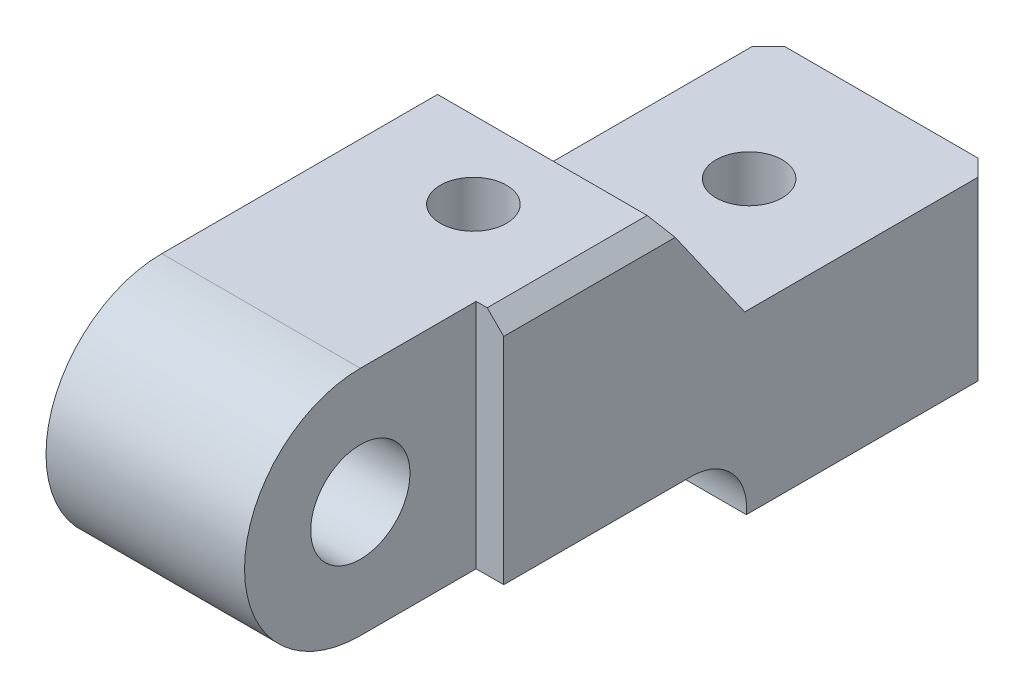
ISO-10303-21;
HEADER;
FILE_DESCRIPTION(('STEP AP214'),'2;1');
FILE_NAME('part.step','',(''),(''),'','','');
FILE_SCHEMA(('AUTOMOTIVE_DESIGN { 1 0 10303 214 1 1 1 1 }'));
ENDSEC;
DATA;
#1=APPLICATION_CONTEXT('core data for automotive mechanical design processes');
#2=APPLICATION_PROTOCOL_DEFINITION('international standard','automotive_design',2000,#1);
#3=PRODUCT_CONTEXT('',#1,'mechanical');
#4=PRODUCT('Part','Part','',(#3));
#5=PRODUCT_RELATED_PRODUCT_CATEGORY('part','',(#4));
#6=PRODUCT_DEFINITION_FORMATION('','',#4);
#7=PRODUCT_DEFINITION_CONTEXT('part definition',#1,'design');
#8=PRODUCT_DEFINITION('design','',#6,#7);
#9=PRODUCT_DEFINITION_SHAPE('','',#8);
#10=(LENGTH_UNIT() NAMED_UNIT(*) SI_UNIT(.MILLI.,.METRE.));
#11=(NAMED_UNIT(*) PLANE_ANGLE_UNIT() SI_UNIT($,.RADIAN.));
#12=(NAMED_UNIT(*) SI_UNIT($,.STERADIAN.) SOLID_ANGLE_UNIT());
#13=UNCERTAINTY_MEASURE_WITH_UNIT(LENGTH_MEASURE(1.E-05),#10,'distance_accuracy_value','');
#14=(GEOMETRIC_REPRESENTATION_CONTEXT(3) GLOBAL_UNCERTAINTY_ASSIGNED_CONTEXT((#13)) GLOBAL_UNIT_ASSIGNED_CONTEXT((#10,
#11,#12)) REPRESENTATION_CONTEXT('',''));
#15=CARTESIAN_POINT('',(0.,0.,0.));
#16=DIRECTION('',(0.,0.,1.));
#17=DIRECTION('',(1.,0.,0.));
#18=AXIS2_PLACEMENT_3D('',#15,#16,#17);
#19=CARTESIAN_POINT('',(20.5,-32.,-110.));
#20=DIRECTION('',(0.,1.,0.));
#21=DIRECTION('',(0.,0.,1.));
#22=AXIS2_PLACEMENT_3D('',#19,#20,#21);
#23=PLANE('',#22);
#24=DIRECTION('',(0.,0.,-1.));
#25=VECTOR('',#24,1.);
#26=CARTESIAN_POINT('',(-20.5,-32.,-110.));
#27=LINE('',#26,#25);
#28=CARTESIAN_POINT('',(-20.5,-32.,-65.));
#29=VERTEX_POINT('',#28);
#30=CARTESIAN_POINT('',(-20.5,-32.,-107.));
#31=VERTEX_POINT('',#30);
#32=EDGE_CURVE('E257',#29,#31,#27,.T.);
#33=ORIENTED_EDGE('',*,*,#32,.T.);
#34=DIRECTION('',(-0.707106781186544,0.,0.707106781186551));
#35=VECTOR('',#34,1.);
#36=CARTESIAN_POINT('',(-17.5,-32.,-110.));
#37=LINE('',#36,#35);
#38=CARTESIAN_POINT('',(-17.5,-32.,-110.));
#39=VERTEX_POINT('',#38);
#40=EDGE_CURVE('E313',#31,#39,#37,.F.);
#41=ORIENTED_EDGE('',*,*,#40,.T.);
#42=DIRECTION('',(-1.,0.,0.));
#43=VECTOR('',#42,1.);
#44=CARTESIAN_POINT('',(20.5,-32.,-110.));
#45=LINE('',#44,#43);
#46=CARTESIAN_POINT('',(-6.,-32.,-110.));
#47=VERTEX_POINT('',#46);
#48=EDGE_CURVE('E276',#47,#39,#45,.T.);
#49=ORIENTED_EDGE('',*,*,#48,.F.);
#50=DIRECTION('',(0.,0.,-1.));
#51=VECTOR('',#50,1.);
#52=CARTESIAN_POINT('',(-6.,-32.,21.));
#53=LINE('',#52,#51);
#54=CARTESIAN_POINT('',(-6.,-32.,-65.));
#55=VERTEX_POINT('',#54);
#56=EDGE_CURVE('E199',#55,#47,#53,.T.);
#57=ORIENTED_EDGE('',*,*,#56,.F.);
#58=DIRECTION('',(-1.,0.,0.));
#59=VECTOR('',#58,1.);
#60=CARTESIAN_POINT('',(20.5,-32.,-65.));
#61=LINE('',#60,#59);
#62=EDGE_CURVE('E282',#55,#29,#61,.T.);
#63=ORIENTED_EDGE('',*,*,#62,.T.);
#64=EDGE_LOOP('',(#33,#41,#49,#57,#63));
#65=FACE_BOUND('',#64,.T.);
#66=ADVANCED_FACE('F43',(#65),#23,.F.);
#67=CARTESIAN_POINT('',(20.5,0.,-110.));
#68=DIRECTION('',(0.,0.,1.));
#69=DIRECTION('',(1.,0.,0.));
#70=AXIS2_PLACEMENT_3D('',#67,#68,#69);
#71=PLANE('',#70);
#72=ORIENTED_EDGE('',*,*,#48,.T.);
#73=DIRECTION('',(0.,1.,0.));
#74=VECTOR('',#73,1.);
#75=CARTESIAN_POINT('',(-17.5,0.,-110.));
#76=LINE('',#75,#74);
#77=CARTESIAN_POINT('',(-17.5,0.,-110.));
#78=VERTEX_POINT('',#77);
#79=EDGE_CURVE('E304',#39,#78,#76,.T.);
#80=ORIENTED_EDGE('',*,*,#79,.T.);
#81=DIRECTION('',(-1.,0.,0.));
#82=VECTOR('',#81,1.);
#83=CARTESIAN_POINT('',(20.5,0.,-110.));
#84=LINE('',#83,#82);
#85=CARTESIAN_POINT('',(17.5,0.,-110.));
#86=VERTEX_POINT('',#85);
#87=EDGE_CURVE('E277',#86,#78,#84,.T.);
#88=ORIENTED_EDGE('',*,*,#87,.F.);
#89=DIRECTION('',(0.,-1.,0.));
#90=VECTOR('',#89,1.);
#91=CARTESIAN_POINT('',(17.5,-32.,-110.));
#92=LINE('',#91,#90);
#93=CARTESIAN_POINT('',(17.5,-32.,-110.));
#94=VERTEX_POINT('',#93);
#95=EDGE_CURVE('E298',#86,#94,#92,.T.);
#96=ORIENTED_EDGE('',*,*,#95,.T.);
#97=CARTESIAN_POINT('',(6.,-32.,-110.));
#98=VERTEX_POINT('',#97);
#99=EDGE_CURVE('E191',#94,#98,#45,.T.);
#100=ORIENTED_EDGE('',*,*,#99,.T.);
#101=DIRECTION('',(0.,-1.,0.));
#102=VECTOR('',#101,1.);
#103=CARTESIAN_POINT('',(6.,-25.,-110.));
#104=LINE('',#103,#102);
#105=CARTESIAN_POINT('',(6.,-25.,-110.));
#106=VERTEX_POINT('',#105);
#107=EDGE_CURVE('E175',#106,#98,#104,.T.);
#108=ORIENTED_EDGE('',*,*,#107,.F.);
#109=DIRECTION('',(1.,0.,0.));
#110=VECTOR('',#109,1.);
#111=CARTESIAN_POINT('',(6.,-25.,-110.));
#112=LINE('',#111,#110);
#113=CARTESIAN_POINT('',(-6.,-25.,-110.));
#114=VERTEX_POINT('',#113);
#115=EDGE_CURVE('E181',#114,#106,#112,.T.);
#116=ORIENTED_EDGE('',*,*,#115,.F.);
#117=DIRECTION('',(0.,1.,0.));
#118=VECTOR('',#117,1.);
#119=CARTESIAN_POINT('',(-6.,-25.,-110.));
#120=LINE('',#119,#118);
#121=EDGE_CURVE('E186',#47,#114,#120,.T.);
#122=ORIENTED_EDGE('',*,*,#121,.F.);
#123=EDGE_LOOP('',(#72,#80,#88,#96,#100,#108,#116,#122));
#124=FACE_BOUND('',#123,.T.);
#125=ADVANCED_FACE('F194',(#124),#71,.F.);
#126=CARTESIAN_POINT('',(20.5,0.,0.));
#127=DIRECTION('',(-1.,0.,0.));
#128=DIRECTION('',(0.,0.,1.));
#129=AXIS2_PLACEMENT_3D('',#126,#127,#128);
#130=CYLINDRICAL_SURFACE('',#129,21.);
#131=CARTESIAN_POINT('',(15.5,0.,0.));
#132=DIRECTION('',(1.,0.,0.));
#133=DIRECTION('',(0.,0.,-1.));
#134=AXIS2_PLACEMENT_3D('',#131,#132,#133);
#135=CIRCLE('',#134,21.);
#136=CARTESIAN_POINT('',(15.5,21.,0.));
#137=VERTEX_POINT('',#136);
#138=CARTESIAN_POINT('',(15.5,-21.,0.));
#139=VERTEX_POINT('',#138);
#140=EDGE_CURVE('E226',#137,#139,#135,.T.);
#141=ORIENTED_EDGE('',*,*,#140,.F.);
#142=DIRECTION('',(-1.,0.,0.));
#143=VECTOR('',#142,1.);
#144=CARTESIAN_POINT('',(20.5,21.,0.));
#145=LINE('',#144,#143);
#146=CARTESIAN_POINT('',(-20.5,21.,0.));
#147=VERTEX_POINT('',#146);
#148=EDGE_CURVE('E252',#137,#147,#145,.T.);
#149=ORIENTED_EDGE('',*,*,#148,.T.);
#150=CARTESIAN_POINT('',(-20.5,0.,0.));
#151=DIRECTION('',(1.,0.,0.));
#152=DIRECTION('',(0.,0.,-1.));
#153=AXIS2_PLACEMENT_3D('',#150,#151,#152);
#154=CIRCLE('',#153,21.);
#155=CARTESIAN_POINT('',(-20.5,-21.,0.));
#156=VERTEX_POINT('',#155);
#157=EDGE_CURVE('E236',#147,#156,#154,.T.);
#158=ORIENTED_EDGE('',*,*,#157,.T.);
#159=DIRECTION('',(-1.,0.,0.));
#160=VECTOR('',#159,1.);
#161=CARTESIAN_POINT('',(20.5,-21.,0.));
#162=LINE('',#161,#160);
#163=EDGE_CURVE('E290',#139,#156,#162,.T.);
#164=ORIENTED_EDGE('',*,*,#163,.F.);
#165=EDGE_LOOP('',(#141,#149,#158,#164));
#166=FACE_BOUND('',#165,.T.);
#167=ADVANCED_FACE('F367',(#166),#130,.T.);
#168=CARTESIAN_POINT('',(20.5,-21.,-55.0501256289338));
#169=DIRECTION('',(0.,1.,0.));
#170=DIRECTION('',(0.,0.,1.));
#171=AXIS2_PLACEMENT_3D('',#168,#169,#170);
#172=PLANE('',#171);
#173=CARTESIAN_POINT('',(0.,-21.,-36.));
#174=DIRECTION('',(0.,1.,0.));
#175=DIRECTION('',(0.,0.,1.));
#176=AXIS2_PLACEMENT_3D('',#173,#174,#175);
#177=CIRCLE('',#176,6.);
#178=CARTESIAN_POINT('',(0.,-21.,-30.));
#179=VERTEX_POINT('',#178);
#180=EDGE_CURVE('E232',#179,#179,#177,.T.);
#181=ORIENTED_EDGE('',*,*,#180,.T.);
#182=EDGE_LOOP('',(#181));
#183=FACE_BOUND('',#182,.T.);
#184=DIRECTION('',(0.,0.,-1.));
#185=VECTOR('',#184,1.);
#186=CARTESIAN_POINT('',(15.5,-21.,-55.0501256289338));
#187=LINE('',#186,#185);
#188=CARTESIAN_POINT('',(15.5,-21.,-21.));
#189=VERTEX_POINT('',#188);
#190=EDGE_CURVE('E227',#139,#189,#187,.T.);
#191=ORIENTED_EDGE('',*,*,#190,.F.);
#192=ORIENTED_EDGE('',*,*,#163,.T.);
#193=DIRECTION('',(0.,0.,-1.));
#194=VECTOR('',#193,1.);
#195=CARTESIAN_POINT('',(-20.5,-21.,-55.0501256289338));
#196=LINE('',#195,#194);
#197=CARTESIAN_POINT('',(-20.5,-21.,-55.0501256289338));
#198=VERTEX_POINT('',#197);
#199=EDGE_CURVE('E254',#156,#198,#196,.T.);
#200=ORIENTED_EDGE('',*,*,#199,.T.);
#201=DIRECTION('',(-1.,0.,0.));
#202=VECTOR('',#201,1.);
#203=CARTESIAN_POINT('',(20.5,-21.,-55.0501256289338));
#204=LINE('',#203,#202);
#205=CARTESIAN_POINT('',(20.5,-21.,-55.0501256289338));
#206=VERTEX_POINT('',#205);
#207=EDGE_CURVE('E283',#206,#198,#204,.T.);
#208=ORIENTED_EDGE('',*,*,#207,.F.);
#209=DIRECTION('',(0.,0.,-1.));
#210=VECTOR('',#209,1.);
#211=CARTESIAN_POINT('',(20.5,-21.,-55.0501256289338));
#212=LINE('',#211,#210);
#213=CARTESIAN_POINT('',(20.5,-21.,-21.));
#214=VERTEX_POINT('',#213);
#215=EDGE_CURVE('E239',#214,#206,#212,.T.);
#216=ORIENTED_EDGE('',*,*,#215,.F.);
#217=DIRECTION('',(1.,0.,0.));
#218=VECTOR('',#217,1.);
#219=CARTESIAN_POINT('',(20.5,-21.,-21.));
#220=LINE('',#219,#218);
#221=EDGE_CURVE('E288',#189,#214,#220,.T.);
#222=ORIENTED_EDGE('',*,*,#221,.F.);
#223=EDGE_LOOP('',(#191,#192,#200,#208,#216,#222));
#224=FACE_BOUND('',#223,.T.);
#225=ADVANCED_FACE('F388',(#183,#224),#172,.F.);
#226=CARTESIAN_POINT('',(20.5,0.,0.));
#227=DIRECTION('',(-1.,0.,0.));
#228=DIRECTION('',(0.,0.,1.));
#229=AXIS2_PLACEMENT_3D('',#226,#227,#228);
#230=CYLINDRICAL_SURFACE('',#229,9.);
#231=CARTESIAN_POINT('',(-20.5,0.,0.));
#232=DIRECTION('',(1.,0.,0.));
#233=DIRECTION('',(0.,0.,-1.));
#234=AXIS2_PLACEMENT_3D('',#231,#232,#233);
#235=CIRCLE('',#234,9.);
#236=CARTESIAN_POINT('',(-20.5,0.,-9.));
#237=VERTEX_POINT('',#236);
#238=EDGE_CURVE('E233',#237,#237,#235,.T.);
#239=ORIENTED_EDGE('',*,*,#238,.F.);
#240=EDGE_LOOP('',(#239));
#241=FACE_BOUND('',#240,.T.);
#242=CARTESIAN_POINT('',(15.5,0.,0.));
#243=DIRECTION('',(1.,0.,0.));
#244=DIRECTION('',(0.,0.,-1.));
#245=AXIS2_PLACEMENT_3D('',#242,#243,#244);
#246=CIRCLE('',#245,9.);
#247=CARTESIAN_POINT('',(15.5,0.,-9.));
#248=VERTEX_POINT('',#247);
#249=EDGE_CURVE('E225',#248,#248,#246,.T.);
#250=ORIENTED_EDGE('',*,*,#249,.T.);
#251=EDGE_LOOP('',(#250));
#252=FACE_BOUND('',#251,.T.);
#253=ADVANCED_FACE('F395',(#241,#252),#230,.F.);
#254=CARTESIAN_POINT('',(20.5,0.,0.));
#255=DIRECTION('',(1.,0.,0.));
#256=DIRECTION('',(0.,0.,-1.));
#257=AXIS2_PLACEMENT_3D('',#254,#255,#256);
#258=PLANE('',#257);
#259=DIRECTION('',(0.,0.,-1.));
#260=VECTOR('',#259,1.);
#261=CARTESIAN_POINT('',(20.5,-32.,-110.));
#262=LINE('',#261,#260);
#263=CARTESIAN_POINT('',(20.5,-32.,-65.));
#264=VERTEX_POINT('',#263);
#265=CARTESIAN_POINT('',(20.5,-32.,-107.));
#266=VERTEX_POINT('',#265);
#267=EDGE_CURVE('E241',#264,#266,#262,.T.);
#268=ORIENTED_EDGE('',*,*,#267,.T.);
#269=DIRECTION('',(0.,1.,0.));
#270=VECTOR('',#269,1.);
#271=CARTESIAN_POINT('',(20.5,0.,-107.));
#272=LINE('',#271,#270);
#273=CARTESIAN_POINT('',(20.5,0.,-107.));
#274=VERTEX_POINT('',#273);
#275=EDGE_CURVE('E316',#266,#274,#272,.T.);
#276=ORIENTED_EDGE('',*,*,#275,.T.);
#277=DIRECTION('',(0.,0.,1.));
#278=VECTOR('',#277,1.);
#279=CARTESIAN_POINT('',(20.5,0.,-64.7043583024038));
#280=LINE('',#279,#278);
#281=CARTESIAN_POINT('',(20.5,0.,-64.7043583024038));
#282=VERTEX_POINT('',#281);
#283=EDGE_CURVE('E249',#274,#282,#280,.T.);
#284=ORIENTED_EDGE('',*,*,#283,.T.);
#285=DIRECTION('',(0.,0.819152044288993,0.573576436351044));
#286=VECTOR('',#285,1.);
#287=CARTESIAN_POINT('',(20.5,21.,-50.));
#288=LINE('',#287,#286);
#289=CARTESIAN_POINT('',(20.5,18.,-52.1006226146291));
#290=VERTEX_POINT('',#289);
#291=EDGE_CURVE('E246',#282,#290,#288,.T.);
#292=ORIENTED_EDGE('',*,*,#291,.T.);
#293=DIRECTION('',(0.,0.,1.));
#294=VECTOR('',#293,1.);
#295=CARTESIAN_POINT('',(20.5,18.,-21.));
#296=LINE('',#295,#294);
#297=CARTESIAN_POINT('',(20.5,18.,-21.));
#298=VERTEX_POINT('',#297);
#299=EDGE_CURVE('E311',#290,#298,#296,.T.);
#300=ORIENTED_EDGE('',*,*,#299,.T.);
#301=DIRECTION('',(0.,1.,0.));
#302=VECTOR('',#301,1.);
#303=CARTESIAN_POINT('',(20.5,-32.,-21.));
#304=LINE('',#303,#302);
#305=EDGE_CURVE('E218',#214,#298,#304,.T.);
#306=ORIENTED_EDGE('',*,*,#305,.F.);
#307=ORIENTED_EDGE('',*,*,#215,.T.);
#308=CARTESIAN_POINT('',(20.5,-31.,-55.0501256289338));
#309=DIRECTION('',(-1.,0.,0.));
#310=DIRECTION('',(0.,0.,-1.));
#311=AXIS2_PLACEMENT_3D('',#308,#309,#310);
#312=CIRCLE('',#311,10.);
#313=EDGE_CURVE('E242',#206,#264,#312,.T.);
#314=ORIENTED_EDGE('',*,*,#313,.T.);
#315=EDGE_LOOP('',(#268,#276,#284,#292,#300,#306,#307,#314));
#316=FACE_BOUND('',#315,.T.);
#317=ADVANCED_FACE('F328',(#316),#258,.T.);
#318=CARTESIAN_POINT('',(-20.5,0.,0.));
#319=DIRECTION('',(1.,0.,0.));
#320=DIRECTION('',(0.,0.,-1.));
#321=AXIS2_PLACEMENT_3D('',#318,#319,#320);
#322=PLANE('',#321);
#323=DIRECTION('',(0.,0.,1.));
#324=VECTOR('',#323,1.);
#325=CARTESIAN_POINT('',(-20.5,0.,-64.7043583024038));
#326=LINE('',#325,#324);
#327=CARTESIAN_POINT('',(-20.5,0.,-107.));
#328=VERTEX_POINT('',#327);
#329=CARTESIAN_POINT('',(-20.5,0.,-64.7043583024038));
#330=VERTEX_POINT('',#329);
#331=EDGE_CURVE('E263',#328,#330,#326,.T.);
#332=ORIENTED_EDGE('',*,*,#331,.F.);
#333=DIRECTION('',(0.,-1.,0.));
#334=VECTOR('',#333,1.);
#335=CARTESIAN_POINT('',(-20.5,0.,-107.));
#336=LINE('',#335,#334);
#337=EDGE_CURVE('E310',#328,#31,#336,.T.);
#338=ORIENTED_EDGE('',*,*,#337,.T.);
#339=ORIENTED_EDGE('',*,*,#32,.F.);
#340=CARTESIAN_POINT('',(-20.5,-31.,-55.0501256289338));
#341=DIRECTION('',(-1.,0.,0.));
#342=DIRECTION('',(0.,0.,-1.));
#343=AXIS2_PLACEMENT_3D('',#340,#341,#342);
#344=CIRCLE('',#343,10.);
#345=EDGE_CURVE('E260',#198,#29,#344,.T.);
#346=ORIENTED_EDGE('',*,*,#345,.F.);
#347=ORIENTED_EDGE('',*,*,#199,.F.);
#348=ORIENTED_EDGE('',*,*,#157,.F.);
#349=DIRECTION('',(0.,0.,1.));
#350=VECTOR('',#349,1.);
#351=CARTESIAN_POINT('',(-20.5,21.,0.));
#352=LINE('',#351,#350);
#353=CARTESIAN_POINT('',(-20.5,21.,-50.));
#354=VERTEX_POINT('',#353);
#355=EDGE_CURVE('E244',#354,#147,#352,.T.);
#356=ORIENTED_EDGE('',*,*,#355,.F.);
#357=DIRECTION('',(0.,0.819152044288993,0.573576436351044));
#358=VECTOR('',#357,1.);
#359=CARTESIAN_POINT('',(-20.5,21.,-50.));
#360=LINE('',#359,#358);
#361=EDGE_CURVE('E264',#330,#354,#360,.T.);
#362=ORIENTED_EDGE('',*,*,#361,.F.);
#363=EDGE_LOOP('',(#332,#338,#339,#346,#347,#348,#356,#362));
#364=FACE_BOUND('',#363,.T.);
#365=ORIENTED_EDGE('',*,*,#238,.T.);
#366=EDGE_LOOP('',(#365));
#367=FACE_BOUND('',#366,.T.);
#368=ADVANCED_FACE('F350',(#364,#367),#322,.F.);
#369=CARTESIAN_POINT('',(20.5,-31.,-55.0501256289338));
#370=DIRECTION('',(-1.,0.,0.));
#371=DIRECTION('',(0.,0.,1.));
#372=AXIS2_PLACEMENT_3D('',#369,#370,#371);
#373=CYLINDRICAL_SURFACE('',#372,10.);
#374=ORIENTED_EDGE('',*,*,#62,.F.);
#375=CARTESIAN_POINT('',(-6.,-31.,-55.0501256289338));
#376=DIRECTION('',(-1.,0.,0.));
#377=DIRECTION('',(0.,-1.,0.));
#378=AXIS2_PLACEMENT_3D('',#375,#376,#377);
#379=CIRCLE('',#378,10.);
#380=CARTESIAN_POINT('',(-6.,-25.,-63.0501256289338));
#381=VERTEX_POINT('',#380);
#382=EDGE_CURVE('E209',#55,#381,#379,.F.);
#383=ORIENTED_EDGE('',*,*,#382,.T.);
#384=DIRECTION('',(-1.,0.,0.));
#385=VECTOR('',#384,1.);
#386=CARTESIAN_POINT('',(20.5,-25.,-63.0501256289338));
#387=LINE('',#386,#385);
#388=CARTESIAN_POINT('',(6.,-25.,-63.0501256289338));
#389=VERTEX_POINT('',#388);
#390=EDGE_CURVE('E205',#381,#389,#387,.F.);
#391=ORIENTED_EDGE('',*,*,#390,.T.);
#392=CARTESIAN_POINT('',(6.,-31.,-55.0501256289338));
#393=DIRECTION('',(1.,0.,0.));
#394=DIRECTION('',(0.,1.,0.));
#395=AXIS2_PLACEMENT_3D('',#392,#393,#394);
#396=CIRCLE('',#395,10.);
#397=CARTESIAN_POINT('',(6.,-32.,-65.));
#398=VERTEX_POINT('',#397);
#399=EDGE_CURVE('E210',#389,#398,#396,.F.);
#400=ORIENTED_EDGE('',*,*,#399,.T.);
#401=EDGE_CURVE('E284',#264,#398,#61,.T.);
#402=ORIENTED_EDGE('',*,*,#401,.F.);
#403=ORIENTED_EDGE('',*,*,#313,.F.);
#404=ORIENTED_EDGE('',*,*,#207,.T.);
#405=ORIENTED_EDGE('',*,*,#345,.T.);
#406=EDGE_LOOP('',(#374,#383,#391,#400,#402,#403,#404,#405));
#407=FACE_BOUND('',#406,.T.);
#408=ADVANCED_FACE('F372',(#407),#373,.F.);
#409=ORIENTED_EDGE('',*,*,#99,.F.);
#410=DIRECTION('',(0.707106781186548,0.,0.707106781186548));
#411=VECTOR('',#410,1.);
#412=CARTESIAN_POINT('',(20.5,-32.,-107.));
#413=LINE('',#412,#411);
#414=EDGE_CURVE('E317',#94,#266,#413,.T.);
#415=ORIENTED_EDGE('',*,*,#414,.T.);
#416=ORIENTED_EDGE('',*,*,#267,.F.);
#417=ORIENTED_EDGE('',*,*,#401,.T.);
#418=DIRECTION('',(0.,0.,-1.));
#419=VECTOR('',#418,1.);
#420=CARTESIAN_POINT('',(6.,-32.,21.));
#421=LINE('',#420,#419);
#422=EDGE_CURVE('E201',#398,#98,#421,.T.);
#423=ORIENTED_EDGE('',*,*,#422,.T.);
#424=EDGE_LOOP('',(#409,#415,#416,#417,#423));
#425=FACE_BOUND('',#424,.T.);
#426=ADVANCED_FACE('F322',(#425),#23,.F.);
#427=CARTESIAN_POINT('',(20.5,0.,-64.7043583024038));
#428=DIRECTION('',(0.,-1.,0.));
#429=DIRECTION('',(0.,0.,-1.));
#430=AXIS2_PLACEMENT_3D('',#427,#428,#429);
#431=PLANE('',#430);
#432=CARTESIAN_POINT('',(0.,0.,-86.));
#433=DIRECTION('',(0.,-1.,0.));
#434=DIRECTION('',(0.,0.,-1.));
#435=AXIS2_PLACEMENT_3D('',#432,#433,#434);
#436=CIRCLE('',#435,6.00000000000001);
#437=CARTESIAN_POINT('',(0.,0.,-92.));
#438=VERTEX_POINT('',#437);
#439=EDGE_CURVE('E231',#438,#438,#436,.T.);
#440=ORIENTED_EDGE('',*,*,#439,.T.);
#441=EDGE_LOOP('',(#440));
#442=FACE_BOUND('',#441,.T.);
#443=ORIENTED_EDGE('',*,*,#87,.T.);
#444=DIRECTION('',(0.707106781186544,0.,-0.707106781186551));
#445=VECTOR('',#444,1.);
#446=CARTESIAN_POINT('',(-17.5,0.,-110.));
#447=LINE('',#446,#445);
#448=EDGE_CURVE('E307',#78,#328,#447,.F.);
#449=ORIENTED_EDGE('',*,*,#448,.T.);
#450=ORIENTED_EDGE('',*,*,#331,.T.);
#451=DIRECTION('',(-1.,0.,0.));
#452=VECTOR('',#451,1.);
#453=CARTESIAN_POINT('',(20.5,0.,-64.7043583024038));
#454=LINE('',#453,#452);
#455=EDGE_CURVE('E272',#282,#330,#454,.T.);
#456=ORIENTED_EDGE('',*,*,#455,.F.);
#457=ORIENTED_EDGE('',*,*,#283,.F.);
#458=DIRECTION('',(-0.707106781186548,0.,-0.707106781186548));
#459=VECTOR('',#458,1.);
#460=CARTESIAN_POINT('',(20.5,0.,-107.));
#461=LINE('',#460,#459);
#462=EDGE_CURVE('E303',#274,#86,#461,.T.);
#463=ORIENTED_EDGE('',*,*,#462,.T.);
#464=EDGE_LOOP('',(#443,#449,#450,#456,#457,#463));
#465=FACE_BOUND('',#464,.T.);
#466=ADVANCED_FACE('F337',(#442,#465),#431,.F.);
#467=CARTESIAN_POINT('',(20.5,21.,-50.));
#468=DIRECTION('',(0.,-0.573576436351045,0.819152044288993));
#469=DIRECTION('',(0.,-0.819152044288993,-0.573576436351045));
#470=AXIS2_PLACEMENT_3D('',#467,#468,#469);
#471=PLANE('',#470);
#472=DIRECTION('',(-1.,0.,0.));
#473=VECTOR('',#472,1.);
#474=CARTESIAN_POINT('',(20.5,21.,-50.));
#475=LINE('',#474,#473);
#476=CARTESIAN_POINT('',(17.5,21.,-50.));
#477=VERTEX_POINT('',#476);
#478=EDGE_CURVE('E271',#477,#354,#475,.T.);
#479=ORIENTED_EDGE('',*,*,#478,.F.);
#480=DIRECTION('',(0.633687274224646,-0.63368727422464,-0.443712606279655));
#481=VECTOR('',#480,1.);
#482=CARTESIAN_POINT('',(5.85060576846214,32.6493942315377,-41.8430063435006));
#483=LINE('',#482,#481);
#484=EDGE_CURVE('E11',#477,#290,#483,.T.);
#485=ORIENTED_EDGE('',*,*,#484,.T.);
#486=ORIENTED_EDGE('',*,*,#291,.F.);
#487=ORIENTED_EDGE('',*,*,#455,.T.);
#488=ORIENTED_EDGE('',*,*,#361,.T.);
#489=EDGE_LOOP('',(#479,#485,#486,#487,#488));
#490=FACE_BOUND('',#489,.T.);
#491=ADVANCED_FACE('F355',(#490),#471,.F.);
#492=CARTESIAN_POINT('',(20.5,21.,0.));
#493=DIRECTION('',(0.,-1.,0.));
#494=DIRECTION('',(0.,0.,-1.));
#495=AXIS2_PLACEMENT_3D('',#492,#493,#494);
#496=PLANE('',#495);
#497=CARTESIAN_POINT('',(0.,21.,-36.));
#498=DIRECTION('',(0.,1.,0.));
#499=DIRECTION('',(0.,0.,1.));
#500=AXIS2_PLACEMENT_3D('',#497,#498,#499);
#501=CIRCLE('',#500,6.);
#502=CARTESIAN_POINT('',(0.,21.,-30.));
#503=VERTEX_POINT('',#502);
#504=EDGE_CURVE('E213',#503,#503,#501,.T.);
#505=ORIENTED_EDGE('',*,*,#504,.F.);
#506=EDGE_LOOP('',(#505));
#507=FACE_BOUND('',#506,.T.);
#508=DIRECTION('',(1.,0.,0.));
#509=VECTOR('',#508,1.);
#510=CARTESIAN_POINT('',(0.,21.,-21.));
#511=LINE('',#510,#509);
#512=CARTESIAN_POINT('',(15.5,21.,-21.));
#513=VERTEX_POINT('',#512);
#514=CARTESIAN_POINT('',(17.5,21.,-21.));
#515=VERTEX_POINT('',#514);
#516=EDGE_CURVE('E212',#513,#515,#511,.T.);
#517=ORIENTED_EDGE('',*,*,#516,.T.);
#518=DIRECTION('',(0.,0.,-1.));
#519=VECTOR('',#518,1.);
#520=CARTESIAN_POINT('',(17.5,21.,-50.));
#521=LINE('',#520,#519);
#522=EDGE_CURVE('E55',#515,#477,#521,.T.);
#523=ORIENTED_EDGE('',*,*,#522,.T.);
#524=ORIENTED_EDGE('',*,*,#478,.T.);
#525=ORIENTED_EDGE('',*,*,#355,.T.);
#526=ORIENTED_EDGE('',*,*,#148,.F.);
#527=DIRECTION('',(0.,0.,-1.));
#528=VECTOR('',#527,1.);
#529=CARTESIAN_POINT('',(15.5,21.,0.));
#530=LINE('',#529,#528);
#531=EDGE_CURVE('E216',#137,#513,#530,.T.);
#532=ORIENTED_EDGE('',*,*,#531,.T.);
#533=EDGE_LOOP('',(#517,#523,#524,#525,#526,#532));
#534=FACE_BOUND('',#533,.T.);
#535=ADVANCED_FACE('F429',(#507,#534),#496,.F.);
#536=CARTESIAN_POINT('',(0.,-32.,-21.));
#537=DIRECTION('',(0.,0.,1.));
#538=DIRECTION('',(0.,-1.,0.));
#539=AXIS2_PLACEMENT_3D('',#536,#537,#538);
#540=PLANE('',#539);
#541=ORIENTED_EDGE('',*,*,#305,.T.);
#542=DIRECTION('',(-0.707106781186551,0.707106781186544,0.));
#543=VECTOR('',#542,1.);
#544=CARTESIAN_POINT('',(35.2499999999999,3.25000000000023,-21.));
#545=LINE('',#544,#543);
#546=EDGE_CURVE('E67',#298,#515,#545,.T.);
#547=ORIENTED_EDGE('',*,*,#546,.T.);
#548=ORIENTED_EDGE('',*,*,#516,.F.);
#549=DIRECTION('',(0.,1.,0.));
#550=VECTOR('',#549,1.);
#551=CARTESIAN_POINT('',(15.5,-32.,-21.));
#552=LINE('',#551,#550);
#553=EDGE_CURVE('E219',#189,#513,#552,.T.);
#554=ORIENTED_EDGE('',*,*,#553,.F.);
#555=ORIENTED_EDGE('',*,*,#221,.T.);
#556=EDGE_LOOP('',(#541,#547,#548,#554,#555));
#557=FACE_BOUND('',#556,.T.);
#558=ADVANCED_FACE('F430',(#557),#540,.T.);
#559=CARTESIAN_POINT('',(15.5,-32.,0.));
#560=DIRECTION('',(1.,0.,0.));
#561=DIRECTION('',(0.,0.,-1.));
#562=AXIS2_PLACEMENT_3D('',#559,#560,#561);
#563=PLANE('',#562);
#564=ORIENTED_EDGE('',*,*,#249,.F.);
#565=EDGE_LOOP('',(#564));
#566=FACE_BOUND('',#565,.T.);
#567=ORIENTED_EDGE('',*,*,#140,.T.);
#568=ORIENTED_EDGE('',*,*,#190,.T.);
#569=ORIENTED_EDGE('',*,*,#553,.T.);
#570=ORIENTED_EDGE('',*,*,#531,.F.);
#571=EDGE_LOOP('',(#567,#568,#569,#570));
#572=FACE_BOUND('',#571,.T.);
#573=ADVANCED_FACE('F421',(#566,#572),#563,.T.);
#574=CARTESIAN_POINT('',(0.,-32.,-36.));
#575=DIRECTION('',(0.,1.,0.));
#576=DIRECTION('',(0.,0.,1.));
#577=AXIS2_PLACEMENT_3D('',#574,#575,#576);
#578=CYLINDRICAL_SURFACE('',#577,6.);
#579=ORIENTED_EDGE('',*,*,#504,.T.);
#580=EDGE_LOOP('',(#579));
#581=FACE_BOUND('',#580,.T.);
#582=ORIENTED_EDGE('',*,*,#180,.F.);
#583=EDGE_LOOP('',(#582));
#584=FACE_BOUND('',#583,.T.);
#585=ADVANCED_FACE('F426',(#581,#584),#578,.F.);
#586=CARTESIAN_POINT('',(0.,-32.,-86.));
#587=DIRECTION('',(0.,1.,0.));
#588=DIRECTION('',(0.,0.,1.));
#589=AXIS2_PLACEMENT_3D('',#586,#587,#588);
#590=CYLINDRICAL_SURFACE('',#589,6.00000000000001);
#591=CARTESIAN_POINT('',(0.,-25.,-86.));
#592=DIRECTION('',(0.,1.,0.));
#593=DIRECTION('',(0.,0.,1.));
#594=AXIS2_PLACEMENT_3D('',#591,#592,#593);
#595=CIRCLE('',#594,6.00000000000001);
#596=CARTESIAN_POINT('',(6.,-25.,-86.));
#597=VERTEX_POINT('',#596);
#598=CARTESIAN_POINT('',(-6.,-25.,-86.));
#599=VERTEX_POINT('',#598);
#600=EDGE_CURVE('E297',#597,#599,#595,.F.);
#601=ORIENTED_EDGE('',*,*,#600,.T.);
#602=EDGE_CURVE('E296',#599,#597,#595,.F.);
#603=ORIENTED_EDGE('',*,*,#602,.T.);
#604=EDGE_LOOP('',(#601,#603));
#605=FACE_BOUND('',#604,.T.);
#606=ORIENTED_EDGE('',*,*,#439,.F.);
#607=EDGE_LOOP('',(#606));
#608=FACE_BOUND('',#607,.T.);
#609=ADVANCED_FACE('F423',(#605,#608),#590,.F.);
#610=CARTESIAN_POINT('',(-6.,-25.,21.));
#611=DIRECTION('',(-1.,0.,0.));
#612=DIRECTION('',(0.,-1.,0.));
#613=AXIS2_PLACEMENT_3D('',#610,#611,#612);
#614=PLANE('',#613);
#615=ORIENTED_EDGE('',*,*,#382,.F.);
#616=ORIENTED_EDGE('',*,*,#56,.T.);
#617=ORIENTED_EDGE('',*,*,#121,.T.);
#618=DIRECTION('',(0.,0.,-1.));
#619=VECTOR('',#618,1.);
#620=CARTESIAN_POINT('',(-6.,-25.,21.));
#621=LINE('',#620,#619);
#622=EDGE_CURVE('E187',#599,#114,#621,.T.);
#623=ORIENTED_EDGE('',*,*,#622,.F.);
#624=EDGE_CURVE('E176',#381,#599,#621,.T.);
#625=ORIENTED_EDGE('',*,*,#624,.F.);
#626=EDGE_LOOP('',(#615,#616,#617,#623,#625));
#627=FACE_BOUND('',#626,.T.);
#628=ADVANCED_FACE('F416',(#627),#614,.F.);
#629=CARTESIAN_POINT('',(6.,-25.,21.));
#630=DIRECTION('',(1.,0.,0.));
#631=DIRECTION('',(0.,1.,0.));
#632=AXIS2_PLACEMENT_3D('',#629,#630,#631);
#633=PLANE('',#632);
#634=DIRECTION('',(0.,0.,-1.));
#635=VECTOR('',#634,1.);
#636=CARTESIAN_POINT('',(6.,-25.,21.));
#637=LINE('',#636,#635);
#638=EDGE_CURVE('E173',#389,#597,#637,.T.);
#639=ORIENTED_EDGE('',*,*,#638,.T.);
#640=EDGE_CURVE('E166',#597,#106,#637,.T.);
#641=ORIENTED_EDGE('',*,*,#640,.T.);
#642=ORIENTED_EDGE('',*,*,#107,.T.);
#643=ORIENTED_EDGE('',*,*,#422,.F.);
#644=ORIENTED_EDGE('',*,*,#399,.F.);
#645=EDGE_LOOP('',(#639,#641,#642,#643,#644));
#646=FACE_BOUND('',#645,.T.);
#647=ADVANCED_FACE('F172',(#646),#633,.F.);
#648=CARTESIAN_POINT('',(6.,-25.,21.));
#649=DIRECTION('',(0.,1.,0.));
#650=DIRECTION('',(0.,0.,1.));
#651=AXIS2_PLACEMENT_3D('',#648,#649,#650);
#652=PLANE('',#651);
#653=ORIENTED_EDGE('',*,*,#624,.T.);
#654=ORIENTED_EDGE('',*,*,#600,.F.);
#655=ORIENTED_EDGE('',*,*,#638,.F.);
#656=ORIENTED_EDGE('',*,*,#390,.F.);
#657=EDGE_LOOP('',(#653,#654,#655,#656));
#658=FACE_BOUND('',#657,.T.);
#659=ADVANCED_FACE('F408',(#658),#652,.F.);
#660=ORIENTED_EDGE('',*,*,#622,.T.);
#661=ORIENTED_EDGE('',*,*,#115,.T.);
#662=ORIENTED_EDGE('',*,*,#640,.F.);
#663=ORIENTED_EDGE('',*,*,#602,.F.);
#664=EDGE_LOOP('',(#660,#661,#662,#663));
#665=FACE_BOUND('',#664,.T.);
#666=ADVANCED_FACE('F184',(#665),#652,.F.);
#667=CARTESIAN_POINT('',(-17.5,0.,-110.));
#668=DIRECTION('',(0.707106781186551,0.,0.707106781186544));
#669=DIRECTION('',(0.,1.,0.));
#670=AXIS2_PLACEMENT_3D('',#667,#668,#669);
#671=PLANE('',#670);
#672=ORIENTED_EDGE('',*,*,#40,.F.);
#673=ORIENTED_EDGE('',*,*,#337,.F.);
#674=ORIENTED_EDGE('',*,*,#448,.F.);
#675=ORIENTED_EDGE('',*,*,#79,.F.);
#676=EDGE_LOOP('',(#672,#673,#674,#675));
#677=FACE_BOUND('',#676,.T.);
#678=ADVANCED_FACE('F344',(#677),#671,.F.);
#679=CARTESIAN_POINT('',(20.5,0.,-107.));
#680=DIRECTION('',(0.707106781186548,0.,-0.707106781186548));
#681=DIRECTION('',(0.,-1.,0.));
#682=AXIS2_PLACEMENT_3D('',#679,#680,#681);
#683=PLANE('',#682);
#684=ORIENTED_EDGE('',*,*,#414,.F.);
#685=ORIENTED_EDGE('',*,*,#95,.F.);
#686=ORIENTED_EDGE('',*,*,#462,.F.);
#687=ORIENTED_EDGE('',*,*,#275,.F.);
#688=EDGE_LOOP('',(#684,#685,#686,#687));
#689=FACE_BOUND('',#688,.T.);
#690=ADVANCED_FACE('F334',(#689),#683,.T.);
#691=CARTESIAN_POINT('',(20.5,18.,0.));
#692=DIRECTION('',(0.707106781186544,0.707106781186551,0.));
#693=DIRECTION('',(0.,0.,-1.));
#694=AXIS2_PLACEMENT_3D('',#691,#692,#693);
#695=PLANE('',#694);
#696=ORIENTED_EDGE('',*,*,#484,.F.);
#697=ORIENTED_EDGE('',*,*,#522,.F.);
#698=ORIENTED_EDGE('',*,*,#546,.F.);
#699=ORIENTED_EDGE('',*,*,#299,.F.);
#700=EDGE_LOOP('',(#696,#697,#698,#699));
#701=FACE_BOUND('',#700,.T.);
#702=ADVANCED_FACE('F46',(#701),#695,.T.);
#703=CLOSED_SHELL('',(#66,#125,#167,#225,#253,#317,#368,#408,#426,#466,#491,#535,#558,#573,#585,
#609,#628,#647,#659,#666,#678,#690,#702));
#704=MANIFOLD_SOLID_BREP('B2',#703);
#705=ADVANCED_BREP_SHAPE_REPRESENTATION('',(#18,#704),#14);
#706=SHAPE_DEFINITION_REPRESENTATION(#9,#705);
ENDSEC;
END-ISO-10303-21;
